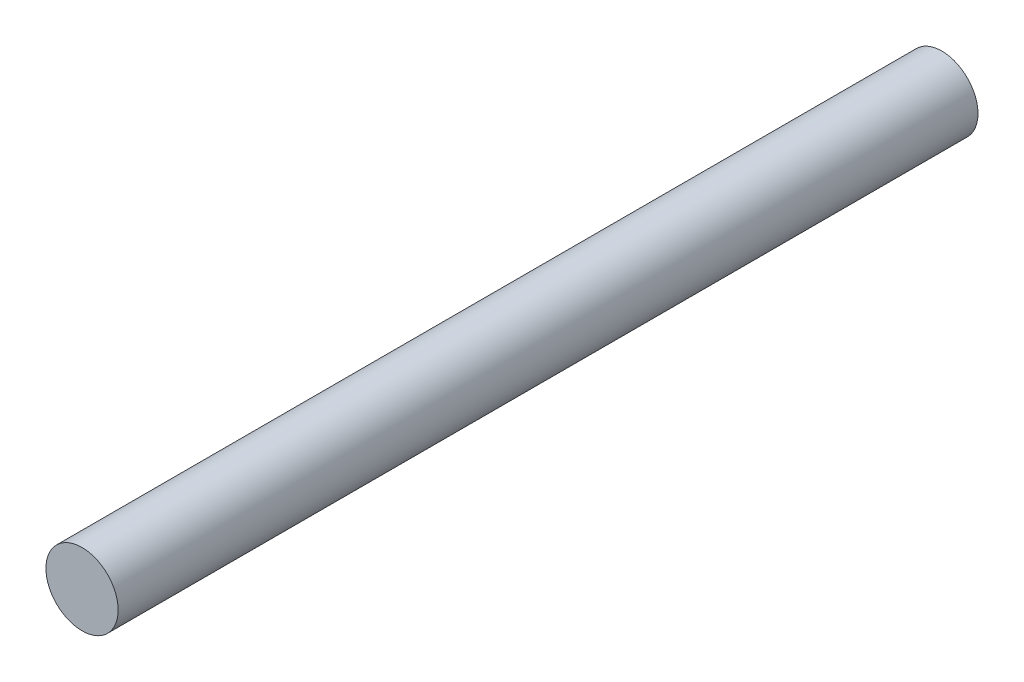
ISO-10303-21;
HEADER;
FILE_DESCRIPTION(('STEP AP214'),'2;1');
FILE_NAME('part.step','',(''),(''),'','','');
FILE_SCHEMA(('AUTOMOTIVE_DESIGN { 1 0 10303 214 1 1 1 1 }'));
ENDSEC;
DATA;
#1=APPLICATION_CONTEXT('core data for automotive mechanical design processes');
#2=APPLICATION_PROTOCOL_DEFINITION('international standard','automotive_design',2000,#1);
#3=PRODUCT_CONTEXT('',#1,'mechanical');
#4=PRODUCT('Part','Part','',(#3));
#5=PRODUCT_RELATED_PRODUCT_CATEGORY('part','',(#4));
#6=PRODUCT_DEFINITION_FORMATION('','',#4);
#7=PRODUCT_DEFINITION_CONTEXT('part definition',#1,'design');
#8=PRODUCT_DEFINITION('design','',#6,#7);
#9=PRODUCT_DEFINITION_SHAPE('','',#8);
#10=(LENGTH_UNIT() NAMED_UNIT(*) SI_UNIT(.MILLI.,.METRE.));
#11=(NAMED_UNIT(*) PLANE_ANGLE_UNIT() SI_UNIT($,.RADIAN.));
#12=(NAMED_UNIT(*) SI_UNIT($,.STERADIAN.) SOLID_ANGLE_UNIT());
#13=UNCERTAINTY_MEASURE_WITH_UNIT(LENGTH_MEASURE(1.E-05),#10,'distance_accuracy_value','');
#14=(GEOMETRIC_REPRESENTATION_CONTEXT(3) GLOBAL_UNCERTAINTY_ASSIGNED_CONTEXT((#13)) GLOBAL_UNIT_ASSIGNED_CONTEXT((#10,
#11,#12)) REPRESENTATION_CONTEXT('',''));
#15=CARTESIAN_POINT('',(0.,0.,0.));
#16=DIRECTION('',(0.,0.,1.));
#17=DIRECTION('',(1.,0.,0.));
#18=AXIS2_PLACEMENT_3D('',#15,#16,#17);
#19=CARTESIAN_POINT('',(0.,0.,50.));
#20=DIRECTION('',(0.,0.,-1.));
#21=DIRECTION('',(-1.,0.,0.));
#22=AXIS2_PLACEMENT_3D('',#19,#20,#21);
#23=CYLINDRICAL_SURFACE('',#22,2.1);
#24=CARTESIAN_POINT('',(0.,0.,50.));
#25=DIRECTION('',(0.,0.,1.));
#26=DIRECTION('',(1.,0.,0.));
#27=AXIS2_PLACEMENT_3D('',#24,#25,#26);
#28=CIRCLE('',#27,2.1);
#29=CARTESIAN_POINT('',(2.1,0.,50.));
#30=VERTEX_POINT('',#29);
#31=EDGE_CURVE('E10',#30,#30,#28,.T.);
#32=ORIENTED_EDGE('',*,*,#31,.F.);
#33=EDGE_LOOP('',(#32));
#34=FACE_BOUND('',#33,.T.);
#35=CARTESIAN_POINT('',(0.,0.,0.));
#36=DIRECTION('',(0.,0.,1.));
#37=DIRECTION('',(1.,0.,0.));
#38=AXIS2_PLACEMENT_3D('',#35,#36,#37);
#39=CIRCLE('',#38,2.1);
#40=CARTESIAN_POINT('',(2.1,0.,0.));
#41=VERTEX_POINT('',#40);
#42=EDGE_CURVE('E40',#41,#41,#39,.T.);
#43=ORIENTED_EDGE('',*,*,#42,.T.);
#44=EDGE_LOOP('',(#43));
#45=FACE_BOUND('',#44,.T.);
#46=ADVANCED_FACE('F37',(#34,#45),#23,.T.);
#47=CARTESIAN_POINT('',(0.,0.,50.));
#48=DIRECTION('',(0.,0.,1.));
#49=DIRECTION('',(1.,0.,0.));
#50=AXIS2_PLACEMENT_3D('',#47,#48,#49);
#51=PLANE('',#50);
#52=ORIENTED_EDGE('',*,*,#31,.T.);
#53=EDGE_LOOP('',(#52));
#54=FACE_BOUND('',#53,.T.);
#55=ADVANCED_FACE('F52',(#54),#51,.T.);
#56=CARTESIAN_POINT('',(0.,0.,0.));
#57=DIRECTION('',(0.,0.,1.));
#58=DIRECTION('',(1.,0.,0.));
#59=AXIS2_PLACEMENT_3D('',#56,#57,#58);
#60=PLANE('',#59);
#61=ORIENTED_EDGE('',*,*,#42,.F.);
#62=EDGE_LOOP('',(#61));
#63=FACE_BOUND('',#62,.T.);
#64=ADVANCED_FACE('F50',(#63),#60,.F.);
#65=CLOSED_SHELL('',(#46,#55,#64));
#66=MANIFOLD_SOLID_BREP('B2',#65);
#67=ADVANCED_BREP_SHAPE_REPRESENTATION('',(#18,#66),#14);
#68=SHAPE_DEFINITION_REPRESENTATION(#9,#67);
ENDSEC;
END-ISO-10303-21;
